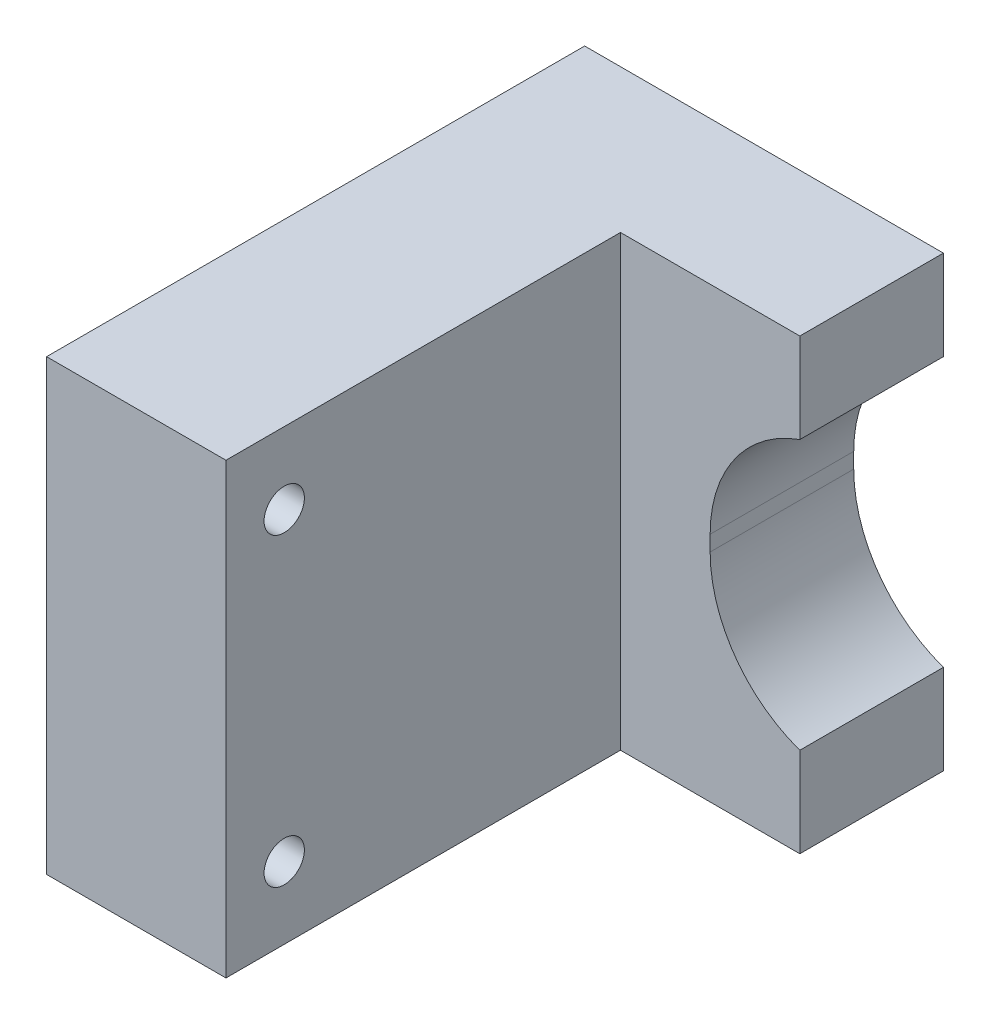
ISO-10303-21;
HEADER;
FILE_DESCRIPTION(('STEP AP214'),'2;1');
FILE_NAME('part.step','',(''),(''),'','','');
FILE_SCHEMA(('AUTOMOTIVE_DESIGN { 1 0 10303 214 1 1 1 1 }'));
ENDSEC;
DATA;
#1=APPLICATION_CONTEXT('core data for automotive mechanical design processes');
#2=APPLICATION_PROTOCOL_DEFINITION('international standard','automotive_design',2000,#1);
#3=PRODUCT_CONTEXT('',#1,'mechanical');
#4=PRODUCT('Part','Part','',(#3));
#5=PRODUCT_RELATED_PRODUCT_CATEGORY('part','',(#4));
#6=PRODUCT_DEFINITION_FORMATION('','',#4);
#7=PRODUCT_DEFINITION_CONTEXT('part definition',#1,'design');
#8=PRODUCT_DEFINITION('design','',#6,#7);
#9=PRODUCT_DEFINITION_SHAPE('','',#8);
#10=(LENGTH_UNIT() NAMED_UNIT(*) SI_UNIT(.MILLI.,.METRE.));
#11=(NAMED_UNIT(*) PLANE_ANGLE_UNIT() SI_UNIT($,.RADIAN.));
#12=(NAMED_UNIT(*) SI_UNIT($,.STERADIAN.) SOLID_ANGLE_UNIT());
#13=UNCERTAINTY_MEASURE_WITH_UNIT(LENGTH_MEASURE(1.E-05),#10,'distance_accuracy_value','');
#14=(GEOMETRIC_REPRESENTATION_CONTEXT(3) GLOBAL_UNCERTAINTY_ASSIGNED_CONTEXT((#13)) GLOBAL_UNIT_ASSIGNED_CONTEXT((#10,
#11,#12)) REPRESENTATION_CONTEXT('',''));
#15=CARTESIAN_POINT('',(0.,0.,0.));
#16=DIRECTION('',(0.,0.,1.));
#17=DIRECTION('',(1.,0.,0.));
#18=AXIS2_PLACEMENT_3D('',#15,#16,#17);
#19=CARTESIAN_POINT('',(-10.,50.,0.));
#20=DIRECTION('',(-1.,0.,0.));
#21=DIRECTION('',(0.,0.,1.));
#22=AXIS2_PLACEMENT_3D('',#19,#20,#21);
#23=PLANE('',#22);
#24=CARTESIAN_POINT('',(-10.,8.,23.5));
#25=DIRECTION('',(-1.,0.,0.));
#26=DIRECTION('',(0.,0.,1.));
#27=AXIS2_PLACEMENT_3D('',#24,#25,#26);
#28=CIRCLE('',#27,4.2164);
#29=CARTESIAN_POINT('',(-10.,8.,27.7164));
#30=VERTEX_POINT('',#29);
#31=EDGE_CURVE('E194',#30,#30,#28,.T.);
#32=ORIENTED_EDGE('',*,*,#31,.F.);
#33=EDGE_LOOP('',(#32));
#34=FACE_BOUND('',#33,.T.);
#35=CARTESIAN_POINT('',(-10.,42.,23.5));
#36=DIRECTION('',(-1.,0.,0.));
#37=DIRECTION('',(0.,0.,1.));
#38=AXIS2_PLACEMENT_3D('',#35,#36,#37);
#39=CIRCLE('',#38,4.2164);
#40=CARTESIAN_POINT('',(-10.,42.,27.7164));
#41=VERTEX_POINT('',#40);
#42=EDGE_CURVE('E208',#41,#41,#39,.T.);
#43=ORIENTED_EDGE('',*,*,#42,.F.);
#44=EDGE_LOOP('',(#43));
#45=FACE_BOUND('',#44,.T.);
#46=DIRECTION('',(0.,0.,-1.));
#47=VECTOR('',#46,1.);
#48=CARTESIAN_POINT('',(-10.,0.,0.));
#49=LINE('',#48,#47);
#50=CARTESIAN_POINT('',(-10.,0.,30.));
#51=VERTEX_POINT('',#50);
#52=CARTESIAN_POINT('',(-10.,0.,-30.));
#53=VERTEX_POINT('',#52);
#54=EDGE_CURVE('E225',#51,#53,#49,.T.);
#55=ORIENTED_EDGE('',*,*,#54,.F.);
#56=DIRECTION('',(0.,-1.,0.));
#57=VECTOR('',#56,1.);
#58=CARTESIAN_POINT('',(-10.,50.,30.));
#59=LINE('',#58,#57);
#60=CARTESIAN_POINT('',(-10.,50.,30.));
#61=VERTEX_POINT('',#60);
#62=EDGE_CURVE('E276',#61,#51,#59,.T.);
#63=ORIENTED_EDGE('',*,*,#62,.F.);
#64=DIRECTION('',(0.,0.,-1.));
#65=VECTOR('',#64,1.);
#66=CARTESIAN_POINT('',(-10.,50.,0.));
#67=LINE('',#66,#65);
#68=CARTESIAN_POINT('',(-10.,50.,-30.));
#69=VERTEX_POINT('',#68);
#70=EDGE_CURVE('E230',#61,#69,#67,.T.);
#71=ORIENTED_EDGE('',*,*,#70,.T.);
#72=DIRECTION('',(0.,-1.,0.));
#73=VECTOR('',#72,1.);
#74=CARTESIAN_POINT('',(-10.,50.,-30.));
#75=LINE('',#74,#73);
#76=EDGE_CURVE('E246',#69,#53,#75,.T.);
#77=ORIENTED_EDGE('',*,*,#76,.T.);
#78=EDGE_LOOP('',(#55,#63,#71,#77));
#79=FACE_BOUND('',#78,.T.);
#80=DIRECTION('',(0.,1.,0.));
#81=VECTOR('',#80,1.);
#82=CARTESIAN_POINT('',(-10.,15.,20.));
#83=LINE('',#82,#81);
#84=CARTESIAN_POINT('',(-10.,15.,20.));
#85=VERTEX_POINT('',#84);
#86=CARTESIAN_POINT('',(-10.,35.,20.));
#87=VERTEX_POINT('',#86);
#88=EDGE_CURVE('E171',#85,#87,#83,.T.);
#89=ORIENTED_EDGE('',*,*,#88,.F.);
#90=DIRECTION('',(0.,0.,-1.));
#91=VECTOR('',#90,1.);
#92=CARTESIAN_POINT('',(-10.,15.,20.));
#93=LINE('',#92,#91);
#94=CARTESIAN_POINT('',(-10.,15.,10.));
#95=VERTEX_POINT('',#94);
#96=EDGE_CURVE('E154',#85,#95,#93,.T.);
#97=ORIENTED_EDGE('',*,*,#96,.T.);
#98=DIRECTION('',(0.,1.,0.));
#99=VECTOR('',#98,1.);
#100=CARTESIAN_POINT('',(-10.,15.,10.));
#101=LINE('',#100,#99);
#102=CARTESIAN_POINT('',(-10.,35.,10.));
#103=VERTEX_POINT('',#102);
#104=EDGE_CURVE('E164',#95,#103,#101,.T.);
#105=ORIENTED_EDGE('',*,*,#104,.T.);
#106=DIRECTION('',(0.,0.,-1.));
#107=VECTOR('',#106,1.);
#108=CARTESIAN_POINT('',(-10.,35.,20.));
#109=LINE('',#108,#107);
#110=EDGE_CURVE('E169',#87,#103,#109,.T.);
#111=ORIENTED_EDGE('',*,*,#110,.F.);
#112=EDGE_LOOP('',(#89,#97,#105,#111));
#113=FACE_BOUND('',#112,.T.);
#114=ADVANCED_FACE('F35',(#34,#45,#79,#113),#23,.T.);
#115=CARTESIAN_POINT('',(-7.,15.,20.));
#116=DIRECTION('',(-1.,0.,0.));
#117=DIRECTION('',(0.,0.,1.));
#118=AXIS2_PLACEMENT_3D('',#115,#116,#117);
#119=PLANE('',#118);
#120=DIRECTION('',(0.,1.,0.));
#121=VECTOR('',#120,1.);
#122=CARTESIAN_POINT('',(-7.,15.,10.));
#123=LINE('',#122,#121);
#124=CARTESIAN_POINT('',(-6.99999999999999,15.,10.));
#125=VERTEX_POINT('',#124);
#126=CARTESIAN_POINT('',(-6.99999999999999,35.,10.));
#127=VERTEX_POINT('',#126);
#128=EDGE_CURVE('E160',#125,#127,#123,.T.);
#129=ORIENTED_EDGE('',*,*,#128,.F.);
#130=DIRECTION('',(0.,0.,-1.));
#131=VECTOR('',#130,1.);
#132=CARTESIAN_POINT('',(-7.,15.,20.));
#133=LINE('',#132,#131);
#134=CARTESIAN_POINT('',(-7.,15.,-30.));
#135=VERTEX_POINT('',#134);
#136=EDGE_CURVE('E157',#125,#135,#133,.T.);
#137=ORIENTED_EDGE('',*,*,#136,.T.);
#138=DIRECTION('',(0.,1.,0.));
#139=VECTOR('',#138,1.);
#140=CARTESIAN_POINT('',(-7.,15.,-30.));
#141=LINE('',#140,#139);
#142=CARTESIAN_POINT('',(-7.,35.,-30.));
#143=VERTEX_POINT('',#142);
#144=EDGE_CURVE('E178',#135,#143,#141,.T.);
#145=ORIENTED_EDGE('',*,*,#144,.T.);
#146=DIRECTION('',(0.,0.,-1.));
#147=VECTOR('',#146,1.);
#148=CARTESIAN_POINT('',(-7.,35.,20.));
#149=LINE('',#148,#147);
#150=EDGE_CURVE('E58',#127,#143,#149,.T.);
#151=ORIENTED_EDGE('',*,*,#150,.F.);
#152=EDGE_LOOP('',(#129,#137,#145,#151));
#153=FACE_BOUND('',#152,.T.);
#154=ADVANCED_FACE('F345',(#153),#119,.F.);
#155=CARTESIAN_POINT('',(30.,50.,0.));
#156=DIRECTION('',(1.,0.,0.));
#157=DIRECTION('',(0.,0.,-1.));
#158=AXIS2_PLACEMENT_3D('',#155,#156,#157);
#159=PLANE('',#158);
#160=DIRECTION('',(0.,0.,1.));
#161=VECTOR('',#160,1.);
#162=CARTESIAN_POINT('',(30.,40.,-13.9903927951499));
#163=LINE('',#162,#161);
#164=CARTESIAN_POINT('',(30.,40.,-30.));
#165=VERTEX_POINT('',#164);
#166=CARTESIAN_POINT('',(30.,40.,-13.9903927951499));
#167=VERTEX_POINT('',#166);
#168=EDGE_CURVE('E222',#165,#167,#163,.T.);
#169=ORIENTED_EDGE('',*,*,#168,.F.);
#170=DIRECTION('',(0.,-1.,0.));
#171=VECTOR('',#170,1.);
#172=CARTESIAN_POINT('',(30.,50.,-30.));
#173=LINE('',#172,#171);
#174=CARTESIAN_POINT('',(30.,50.,-30.));
#175=VERTEX_POINT('',#174);
#176=EDGE_CURVE('E264',#175,#165,#173,.T.);
#177=ORIENTED_EDGE('',*,*,#176,.F.);
#178=DIRECTION('',(0.,0.,1.));
#179=VECTOR('',#178,1.);
#180=CARTESIAN_POINT('',(30.,50.,0.));
#181=LINE('',#180,#179);
#182=CARTESIAN_POINT('',(30.,50.,-13.9903927951499));
#183=VERTEX_POINT('',#182);
#184=EDGE_CURVE('E241',#175,#183,#181,.T.);
#185=ORIENTED_EDGE('',*,*,#184,.T.);
#186=DIRECTION('',(0.,-1.,0.));
#187=VECTOR('',#186,1.);
#188=CARTESIAN_POINT('',(30.,50.,-13.9903927951499));
#189=LINE('',#188,#187);
#190=EDGE_CURVE('E268',#183,#167,#189,.T.);
#191=ORIENTED_EDGE('',*,*,#190,.T.);
#192=EDGE_LOOP('',(#169,#177,#185,#191));
#193=FACE_BOUND('',#192,.T.);
#194=ADVANCED_FACE('F295',(#193),#159,.T.);
#195=CARTESIAN_POINT('',(0.,50.,30.));
#196=DIRECTION('',(0.,0.,1.));
#197=DIRECTION('',(1.,0.,0.));
#198=AXIS2_PLACEMENT_3D('',#195,#196,#197);
#199=PLANE('',#198);
#200=DIRECTION('',(-1.,0.,0.));
#201=VECTOR('',#200,1.);
#202=CARTESIAN_POINT('',(0.,0.,30.));
#203=LINE('',#202,#201);
#204=CARTESIAN_POINT('',(10.,0.,30.));
#205=VERTEX_POINT('',#204);
#206=EDGE_CURVE('E249',#205,#51,#203,.T.);
#207=ORIENTED_EDGE('',*,*,#206,.F.);
#208=DIRECTION('',(0.,-1.,0.));
#209=VECTOR('',#208,1.);
#210=CARTESIAN_POINT('',(10.,50.,30.));
#211=LINE('',#210,#209);
#212=CARTESIAN_POINT('',(10.,50.,30.));
#213=VERTEX_POINT('',#212);
#214=EDGE_CURVE('E274',#213,#205,#211,.T.);
#215=ORIENTED_EDGE('',*,*,#214,.F.);
#216=DIRECTION('',(-1.,0.,0.));
#217=VECTOR('',#216,1.);
#218=CARTESIAN_POINT('',(0.,50.,30.));
#219=LINE('',#218,#217);
#220=EDGE_CURVE('E233',#213,#61,#219,.T.);
#221=ORIENTED_EDGE('',*,*,#220,.T.);
#222=ORIENTED_EDGE('',*,*,#62,.T.);
#223=EDGE_LOOP('',(#207,#215,#221,#222));
#224=FACE_BOUND('',#223,.T.);
#225=ADVANCED_FACE('F327',(#224),#199,.T.);
#226=CARTESIAN_POINT('',(10.,50.,0.));
#227=DIRECTION('',(-1.,0.,0.));
#228=DIRECTION('',(0.,0.,1.));
#229=AXIS2_PLACEMENT_3D('',#226,#227,#228);
#230=PLANE('',#229);
#231=CARTESIAN_POINT('',(10.,8.,23.5));
#232=DIRECTION('',(-1.,0.,0.));
#233=DIRECTION('',(0.,0.,1.));
#234=AXIS2_PLACEMENT_3D('',#231,#232,#233);
#235=CIRCLE('',#234,2.2479);
#236=CARTESIAN_POINT('',(10.,8.,25.7479));
#237=VERTEX_POINT('',#236);
#238=EDGE_CURVE('E205',#237,#237,#235,.T.);
#239=ORIENTED_EDGE('',*,*,#238,.T.);
#240=EDGE_LOOP('',(#239));
#241=FACE_BOUND('',#240,.T.);
#242=CARTESIAN_POINT('',(10.,42.,23.5));
#243=DIRECTION('',(-1.,0.,0.));
#244=DIRECTION('',(0.,0.,1.));
#245=AXIS2_PLACEMENT_3D('',#242,#243,#244);
#246=CIRCLE('',#245,2.2479);
#247=CARTESIAN_POINT('',(10.,42.,25.7479));
#248=VERTEX_POINT('',#247);
#249=EDGE_CURVE('E214',#248,#248,#246,.T.);
#250=ORIENTED_EDGE('',*,*,#249,.T.);
#251=EDGE_LOOP('',(#250));
#252=FACE_BOUND('',#251,.T.);
#253=DIRECTION('',(0.,0.,-1.));
#254=VECTOR('',#253,1.);
#255=CARTESIAN_POINT('',(10.,0.,0.));
#256=LINE('',#255,#254);
#257=CARTESIAN_POINT('',(10.,0.,-13.9903927951499));
#258=VERTEX_POINT('',#257);
#259=EDGE_CURVE('E252',#205,#258,#256,.T.);
#260=ORIENTED_EDGE('',*,*,#259,.T.);
#261=DIRECTION('',(0.,-1.,0.));
#262=VECTOR('',#261,1.);
#263=CARTESIAN_POINT('',(10.,50.,-13.9903927951499));
#264=LINE('',#263,#262);
#265=CARTESIAN_POINT('',(10.,50.,-13.9903927951499));
#266=VERTEX_POINT('',#265);
#267=EDGE_CURVE('E271',#266,#258,#264,.T.);
#268=ORIENTED_EDGE('',*,*,#267,.F.);
#269=DIRECTION('',(0.,0.,-1.));
#270=VECTOR('',#269,1.);
#271=CARTESIAN_POINT('',(10.,50.,0.));
#272=LINE('',#271,#270);
#273=EDGE_CURVE('E237',#213,#266,#272,.T.);
#274=ORIENTED_EDGE('',*,*,#273,.F.);
#275=ORIENTED_EDGE('',*,*,#214,.T.);
#276=EDGE_LOOP('',(#260,#268,#274,#275));
#277=FACE_BOUND('',#276,.T.);
#278=ADVANCED_FACE('F331',(#241,#252,#277),#230,.F.);
#279=CARTESIAN_POINT('',(0.,50.,-13.9903927951499));
#280=DIRECTION('',(0.,0.,-1.));
#281=DIRECTION('',(-1.,0.,0.));
#282=AXIS2_PLACEMENT_3D('',#279,#280,#281);
#283=PLANE('',#282);
#284=DIRECTION('',(0.,-1.,0.));
#285=VECTOR('',#284,1.);
#286=CARTESIAN_POINT('',(20.,40.,-13.9903927951499));
#287=LINE('',#286,#285);
#288=CARTESIAN_POINT('',(20.,25.8578643762691,-13.9903927951499));
#289=VERTEX_POINT('',#288);
#290=CARTESIAN_POINT('',(20.,24.142135623731,-13.9903927951499));
#291=VERTEX_POINT('',#290);
#292=EDGE_CURVE('E218',#289,#291,#287,.T.);
#293=ORIENTED_EDGE('',*,*,#292,.F.);
#294=CARTESIAN_POINT('',(35.,25.8578643762691,-13.9903927951499));
#295=DIRECTION('',(0.,0.,-1.));
#296=DIRECTION('',(-1.,0.,0.));
#297=AXIS2_PLACEMENT_3D('',#294,#295,#296);
#298=CIRCLE('',#297,15.);
#299=EDGE_CURVE('E43',#289,#167,#298,.T.);
#300=ORIENTED_EDGE('',*,*,#299,.T.);
#301=ORIENTED_EDGE('',*,*,#190,.F.);
#302=DIRECTION('',(1.,0.,0.));
#303=VECTOR('',#302,1.);
#304=CARTESIAN_POINT('',(0.,50.,-13.9903927951499));
#305=LINE('',#304,#303);
#306=EDGE_CURVE('E239',#266,#183,#305,.T.);
#307=ORIENTED_EDGE('',*,*,#306,.F.);
#308=ORIENTED_EDGE('',*,*,#267,.T.);
#309=DIRECTION('',(1.,0.,0.));
#310=VECTOR('',#309,1.);
#311=CARTESIAN_POINT('',(0.,0.,-13.9903927951499));
#312=LINE('',#311,#310);
#313=CARTESIAN_POINT('',(30.,0.,-13.9903927951499));
#314=VERTEX_POINT('',#313);
#315=EDGE_CURVE('E254',#258,#314,#312,.T.);
#316=ORIENTED_EDGE('',*,*,#315,.T.);
#317=CARTESIAN_POINT('',(30.,10.,-13.9903927951499));
#318=VERTEX_POINT('',#317);
#319=EDGE_CURVE('E267',#318,#314,#189,.T.);
#320=ORIENTED_EDGE('',*,*,#319,.F.);
#321=CARTESIAN_POINT('',(35.,24.142135623731,-13.9903927951499));
#322=DIRECTION('',(0.,0.,-1.));
#323=DIRECTION('',(-1.,0.,0.));
#324=AXIS2_PLACEMENT_3D('',#321,#322,#323);
#325=CIRCLE('',#324,15.);
#326=EDGE_CURVE('E286',#318,#291,#325,.T.);
#327=ORIENTED_EDGE('',*,*,#326,.T.);
#328=EDGE_LOOP('',(#293,#300,#301,#307,#308,#316,#320,#327));
#329=FACE_BOUND('',#328,.T.);
#330=ADVANCED_FACE('F290',(#329),#283,.F.);
#331=DIRECTION('',(0.,0.,-1.));
#332=VECTOR('',#331,1.);
#333=CARTESIAN_POINT('',(30.,10.,-13.9903927951499));
#334=LINE('',#333,#332);
#335=CARTESIAN_POINT('',(30.,10.,-30.));
#336=VERTEX_POINT('',#335);
#337=EDGE_CURVE('E217',#318,#336,#334,.T.);
#338=ORIENTED_EDGE('',*,*,#337,.F.);
#339=ORIENTED_EDGE('',*,*,#319,.T.);
#340=DIRECTION('',(0.,0.,1.));
#341=VECTOR('',#340,1.);
#342=CARTESIAN_POINT('',(30.,0.,0.));
#343=LINE('',#342,#341);
#344=CARTESIAN_POINT('',(30.,0.,-30.));
#345=VERTEX_POINT('',#344);
#346=EDGE_CURVE('E257',#345,#314,#343,.T.);
#347=ORIENTED_EDGE('',*,*,#346,.F.);
#348=EDGE_CURVE('E263',#336,#345,#173,.T.);
#349=ORIENTED_EDGE('',*,*,#348,.F.);
#350=EDGE_LOOP('',(#338,#339,#347,#349));
#351=FACE_BOUND('',#350,.T.);
#352=ADVANCED_FACE('F312',(#351),#159,.T.);
#353=CARTESIAN_POINT('',(0.,50.,-30.));
#354=DIRECTION('',(0.,0.,1.));
#355=DIRECTION('',(1.,0.,0.));
#356=AXIS2_PLACEMENT_3D('',#353,#354,#355);
#357=PLANE('',#356);
#358=DIRECTION('',(1.,0.,0.));
#359=VECTOR('',#358,1.);
#360=CARTESIAN_POINT('',(-7.,35.,-30.));
#361=LINE('',#360,#359);
#362=CARTESIAN_POINT('',(3.,35.,-30.));
#363=VERTEX_POINT('',#362);
#364=EDGE_CURVE('E187',#143,#363,#361,.T.);
#365=ORIENTED_EDGE('',*,*,#364,.F.);
#366=ORIENTED_EDGE('',*,*,#144,.F.);
#367=DIRECTION('',(-1.,0.,0.));
#368=VECTOR('',#367,1.);
#369=CARTESIAN_POINT('',(-7.,15.,-30.));
#370=LINE('',#369,#368);
#371=CARTESIAN_POINT('',(3.,15.,-30.));
#372=VERTEX_POINT('',#371);
#373=EDGE_CURVE('E183',#372,#135,#370,.T.);
#374=ORIENTED_EDGE('',*,*,#373,.F.);
#375=DIRECTION('',(0.,-1.,0.));
#376=VECTOR('',#375,1.);
#377=CARTESIAN_POINT('',(3.,15.,-30.));
#378=LINE('',#377,#376);
#379=EDGE_CURVE('E189',#363,#372,#378,.T.);
#380=ORIENTED_EDGE('',*,*,#379,.F.);
#381=EDGE_LOOP('',(#365,#366,#374,#380));
#382=FACE_BOUND('',#381,.T.);
#383=ORIENTED_EDGE('',*,*,#176,.T.);
#384=CARTESIAN_POINT('',(35.,25.8578643762691,-30.));
#385=DIRECTION('',(0.,0.,1.));
#386=DIRECTION('',(1.,0.,0.));
#387=AXIS2_PLACEMENT_3D('',#384,#385,#386);
#388=CIRCLE('',#387,15.);
#389=CARTESIAN_POINT('',(20.,25.8578643762691,-30.));
#390=VERTEX_POINT('',#389);
#391=EDGE_CURVE('E11',#165,#390,#388,.T.);
#392=ORIENTED_EDGE('',*,*,#391,.T.);
#393=DIRECTION('',(0.,1.,0.));
#394=VECTOR('',#393,1.);
#395=CARTESIAN_POINT('',(20.,40.,-30.));
#396=LINE('',#395,#394);
#397=CARTESIAN_POINT('',(20.,24.142135623731,-30.));
#398=VERTEX_POINT('',#397);
#399=EDGE_CURVE('E221',#398,#390,#396,.T.);
#400=ORIENTED_EDGE('',*,*,#399,.F.);
#401=CARTESIAN_POINT('',(35.,24.142135623731,-30.));
#402=DIRECTION('',(0.,0.,1.));
#403=DIRECTION('',(1.,0.,0.));
#404=AXIS2_PLACEMENT_3D('',#401,#402,#403);
#405=CIRCLE('',#404,15.);
#406=EDGE_CURVE('E284',#398,#336,#405,.T.);
#407=ORIENTED_EDGE('',*,*,#406,.T.);
#408=ORIENTED_EDGE('',*,*,#348,.T.);
#409=DIRECTION('',(-1.,0.,0.));
#410=VECTOR('',#409,1.);
#411=CARTESIAN_POINT('',(0.,0.,-30.));
#412=LINE('',#411,#410);
#413=EDGE_CURVE('E234',#345,#53,#412,.T.);
#414=ORIENTED_EDGE('',*,*,#413,.T.);
#415=ORIENTED_EDGE('',*,*,#76,.F.);
#416=DIRECTION('',(-1.,0.,0.));
#417=VECTOR('',#416,1.);
#418=CARTESIAN_POINT('',(0.,50.,-30.));
#419=LINE('',#418,#417);
#420=EDGE_CURVE('E244',#175,#69,#419,.T.);
#421=ORIENTED_EDGE('',*,*,#420,.F.);
#422=EDGE_LOOP('',(#383,#392,#400,#407,#408,#414,#415,#421));
#423=FACE_BOUND('',#422,.T.);
#424=ADVANCED_FACE('F300',(#382,#423),#357,.F.);
#425=CARTESIAN_POINT('',(0.,50.,0.));
#426=DIRECTION('',(0.,1.,0.));
#427=DIRECTION('',(0.,0.,1.));
#428=AXIS2_PLACEMENT_3D('',#425,#426,#427);
#429=PLANE('',#428);
#430=ORIENTED_EDGE('',*,*,#70,.F.);
#431=ORIENTED_EDGE('',*,*,#220,.F.);
#432=ORIENTED_EDGE('',*,*,#273,.T.);
#433=ORIENTED_EDGE('',*,*,#306,.T.);
#434=ORIENTED_EDGE('',*,*,#184,.F.);
#435=ORIENTED_EDGE('',*,*,#420,.T.);
#436=EDGE_LOOP('',(#430,#431,#432,#433,#434,#435));
#437=FACE_BOUND('',#436,.T.);
#438=ADVANCED_FACE('F324',(#437),#429,.T.);
#439=CARTESIAN_POINT('',(0.,0.,0.));
#440=DIRECTION('',(0.,1.,0.));
#441=DIRECTION('',(0.,0.,1.));
#442=AXIS2_PLACEMENT_3D('',#439,#440,#441);
#443=PLANE('',#442);
#444=ORIENTED_EDGE('',*,*,#54,.T.);
#445=ORIENTED_EDGE('',*,*,#413,.F.);
#446=ORIENTED_EDGE('',*,*,#346,.T.);
#447=ORIENTED_EDGE('',*,*,#315,.F.);
#448=ORIENTED_EDGE('',*,*,#259,.F.);
#449=ORIENTED_EDGE('',*,*,#206,.T.);
#450=EDGE_LOOP('',(#444,#445,#446,#447,#448,#449));
#451=FACE_BOUND('',#450,.T.);
#452=ADVANCED_FACE('F316',(#451),#443,.F.);
#453=CARTESIAN_POINT('',(20.,0.,0.));
#454=DIRECTION('',(1.,0.,0.));
#455=DIRECTION('',(0.,0.,-1.));
#456=AXIS2_PLACEMENT_3D('',#453,#454,#455);
#457=PLANE('',#456);
#458=ORIENTED_EDGE('',*,*,#292,.T.);
#459=DIRECTION('',(0.,0.,-1.));
#460=VECTOR('',#459,1.);
#461=CARTESIAN_POINT('',(20.,24.142135623731,-30.));
#462=LINE('',#461,#460);
#463=EDGE_CURVE('E281',#291,#398,#462,.T.);
#464=ORIENTED_EDGE('',*,*,#463,.T.);
#465=ORIENTED_EDGE('',*,*,#399,.T.);
#466=DIRECTION('',(0.,0.,1.));
#467=VECTOR('',#466,1.);
#468=CARTESIAN_POINT('',(20.,25.8578643762691,-13.9903927951499));
#469=LINE('',#468,#467);
#470=EDGE_CURVE('E278',#390,#289,#469,.T.);
#471=ORIENTED_EDGE('',*,*,#470,.T.);
#472=EDGE_LOOP('',(#458,#464,#465,#471));
#473=FACE_BOUND('',#472,.T.);
#474=ADVANCED_FACE('F303',(#473),#457,.T.);
#475=CARTESIAN_POINT('',(35.,24.142135623731,-13.9903927951499));
#476=DIRECTION('',(0.,0.,1.));
#477=DIRECTION('',(1.,0.,0.));
#478=AXIS2_PLACEMENT_3D('',#475,#476,#477);
#479=CYLINDRICAL_SURFACE('',#478,15.);
#480=ORIENTED_EDGE('',*,*,#326,.F.);
#481=ORIENTED_EDGE('',*,*,#337,.T.);
#482=ORIENTED_EDGE('',*,*,#406,.F.);
#483=ORIENTED_EDGE('',*,*,#463,.F.);
#484=EDGE_LOOP('',(#480,#481,#482,#483));
#485=FACE_BOUND('',#484,.T.);
#486=ADVANCED_FACE('F307',(#485),#479,.F.);
#487=CARTESIAN_POINT('',(35.,25.8578643762691,-13.9903927951499));
#488=DIRECTION('',(0.,0.,-1.));
#489=DIRECTION('',(-1.,0.,0.));
#490=AXIS2_PLACEMENT_3D('',#487,#488,#489);
#491=CYLINDRICAL_SURFACE('',#490,15.);
#492=ORIENTED_EDGE('',*,*,#391,.F.);
#493=ORIENTED_EDGE('',*,*,#168,.T.);
#494=ORIENTED_EDGE('',*,*,#299,.F.);
#495=ORIENTED_EDGE('',*,*,#470,.F.);
#496=EDGE_LOOP('',(#492,#493,#494,#495));
#497=FACE_BOUND('',#496,.T.);
#498=ADVANCED_FACE('F37',(#497),#491,.F.);
#499=CARTESIAN_POINT('',(-10.,42.,23.5));
#500=DIRECTION('',(-1.,0.,0.));
#501=DIRECTION('',(0.,0.,1.));
#502=AXIS2_PLACEMENT_3D('',#499,#500,#501);
#503=CYLINDRICAL_SURFACE('',#502,2.2479);
#504=ORIENTED_EDGE('',*,*,#249,.F.);
#505=EDGE_LOOP('',(#504));
#506=FACE_BOUND('',#505,.T.);
#507=CARTESIAN_POINT('',(-8.34823237602752,42.,23.5));
#508=DIRECTION('',(-1.,0.,0.));
#509=DIRECTION('',(0.,0.,1.));
#510=AXIS2_PLACEMENT_3D('',#507,#508,#509);
#511=CIRCLE('',#510,2.2479);
#512=CARTESIAN_POINT('',(-8.34823237602752,42.,25.7479));
#513=VERTEX_POINT('',#512);
#514=EDGE_CURVE('E211',#513,#513,#511,.T.);
#515=ORIENTED_EDGE('',*,*,#514,.T.);
#516=EDGE_LOOP('',(#515));
#517=FACE_BOUND('',#516,.T.);
#518=ADVANCED_FACE('F362',(#506,#517),#503,.F.);
#519=CARTESIAN_POINT('',(-10.,42.,23.5));
#520=DIRECTION('',(-1.,0.,0.));
#521=DIRECTION('',(0.,0.,1.));
#522=AXIS2_PLACEMENT_3D('',#519,#520,#521);
#523=CONICAL_SURFACE('',#522,4.2164,0.872664625997166);
#524=ORIENTED_EDGE('',*,*,#514,.F.);
#525=EDGE_LOOP('',(#524));
#526=FACE_BOUND('',#525,.T.);
#527=ORIENTED_EDGE('',*,*,#42,.T.);
#528=EDGE_LOOP('',(#527));
#529=FACE_BOUND('',#528,.T.);
#530=ADVANCED_FACE('F424',(#526,#529),#523,.F.);
#531=CARTESIAN_POINT('',(-10.,8.,23.5));
#532=DIRECTION('',(-1.,0.,0.));
#533=DIRECTION('',(0.,0.,1.));
#534=AXIS2_PLACEMENT_3D('',#531,#532,#533);
#535=CYLINDRICAL_SURFACE('',#534,2.2479);
#536=ORIENTED_EDGE('',*,*,#238,.F.);
#537=EDGE_LOOP('',(#536));
#538=FACE_BOUND('',#537,.T.);
#539=CARTESIAN_POINT('',(-8.34823237602752,8.,23.5));
#540=DIRECTION('',(-1.,0.,0.));
#541=DIRECTION('',(0.,0.,1.));
#542=AXIS2_PLACEMENT_3D('',#539,#540,#541);
#543=CIRCLE('',#542,2.2479);
#544=CARTESIAN_POINT('',(-8.34823237602752,8.,25.7479));
#545=VERTEX_POINT('',#544);
#546=EDGE_CURVE('E202',#545,#545,#543,.T.);
#547=ORIENTED_EDGE('',*,*,#546,.T.);
#548=EDGE_LOOP('',(#547));
#549=FACE_BOUND('',#548,.T.);
#550=ADVANCED_FACE('F430',(#538,#549),#535,.F.);
#551=CARTESIAN_POINT('',(-10.,8.,23.5));
#552=DIRECTION('',(-1.,0.,0.));
#553=DIRECTION('',(0.,0.,1.));
#554=AXIS2_PLACEMENT_3D('',#551,#552,#553);
#555=CONICAL_SURFACE('',#554,4.2164,0.872664625997165);
#556=ORIENTED_EDGE('',*,*,#546,.F.);
#557=EDGE_LOOP('',(#556));
#558=FACE_BOUND('',#557,.T.);
#559=ORIENTED_EDGE('',*,*,#31,.T.);
#560=EDGE_LOOP('',(#559));
#561=FACE_BOUND('',#560,.T.);
#562=ADVANCED_FACE('F437',(#558,#561),#555,.F.);
#563=CARTESIAN_POINT('',(-7.,15.,20.));
#564=DIRECTION('',(0.,-1.,0.));
#565=DIRECTION('',(0.,0.,-1.));
#566=AXIS2_PLACEMENT_3D('',#563,#564,#565);
#567=PLANE('',#566);
#568=DIRECTION('',(0.,0.,-1.));
#569=VECTOR('',#568,1.);
#570=CARTESIAN_POINT('',(3.,15.,20.));
#571=LINE('',#570,#569);
#572=CARTESIAN_POINT('',(3.,15.,20.));
#573=VERTEX_POINT('',#572);
#574=EDGE_CURVE('E195',#573,#372,#571,.T.);
#575=ORIENTED_EDGE('',*,*,#574,.T.);
#576=ORIENTED_EDGE('',*,*,#373,.T.);
#577=ORIENTED_EDGE('',*,*,#136,.F.);
#578=DIRECTION('',(-1.,0.,0.));
#579=VECTOR('',#578,1.);
#580=CARTESIAN_POINT('',(3.,15.,10.));
#581=LINE('',#580,#579);
#582=EDGE_CURVE('E150',#125,#95,#581,.T.);
#583=ORIENTED_EDGE('',*,*,#582,.T.);
#584=ORIENTED_EDGE('',*,*,#96,.F.);
#585=DIRECTION('',(-1.,0.,0.));
#586=VECTOR('',#585,1.);
#587=CARTESIAN_POINT('',(-7.,15.,20.));
#588=LINE('',#587,#586);
#589=EDGE_CURVE('E50',#573,#85,#588,.T.);
#590=ORIENTED_EDGE('',*,*,#589,.F.);
#591=EDGE_LOOP('',(#575,#576,#577,#583,#584,#590));
#592=FACE_BOUND('',#591,.T.);
#593=ADVANCED_FACE('F152',(#592),#567,.F.);
#594=CARTESIAN_POINT('',(3.,15.,20.));
#595=DIRECTION('',(1.,0.,0.));
#596=DIRECTION('',(0.,0.,-1.));
#597=AXIS2_PLACEMENT_3D('',#594,#595,#596);
#598=PLANE('',#597);
#599=DIRECTION('',(0.,0.,-1.));
#600=VECTOR('',#599,1.);
#601=CARTESIAN_POINT('',(3.,35.,20.));
#602=LINE('',#601,#600);
#603=CARTESIAN_POINT('',(3.,35.,20.));
#604=VERTEX_POINT('',#603);
#605=EDGE_CURVE('E197',#604,#363,#602,.T.);
#606=ORIENTED_EDGE('',*,*,#605,.T.);
#607=ORIENTED_EDGE('',*,*,#379,.T.);
#608=ORIENTED_EDGE('',*,*,#574,.F.);
#609=DIRECTION('',(0.,-1.,0.));
#610=VECTOR('',#609,1.);
#611=CARTESIAN_POINT('',(3.,15.,20.));
#612=LINE('',#611,#610);
#613=EDGE_CURVE('E182',#604,#573,#612,.T.);
#614=ORIENTED_EDGE('',*,*,#613,.F.);
#615=EDGE_LOOP('',(#606,#607,#608,#614));
#616=FACE_BOUND('',#615,.T.);
#617=ADVANCED_FACE('F460',(#616),#598,.F.);
#618=CARTESIAN_POINT('',(-7.,35.,20.));
#619=DIRECTION('',(0.,1.,0.));
#620=DIRECTION('',(0.,0.,1.));
#621=AXIS2_PLACEMENT_3D('',#618,#619,#620);
#622=PLANE('',#621);
#623=DIRECTION('',(1.,0.,0.));
#624=VECTOR('',#623,1.);
#625=CARTESIAN_POINT('',(-7.,35.,20.));
#626=LINE('',#625,#624);
#627=EDGE_CURVE('E179',#87,#604,#626,.T.);
#628=ORIENTED_EDGE('',*,*,#627,.F.);
#629=ORIENTED_EDGE('',*,*,#110,.T.);
#630=DIRECTION('',(-1.,0.,0.));
#631=VECTOR('',#630,1.);
#632=CARTESIAN_POINT('',(3.,35.,10.));
#633=LINE('',#632,#631);
#634=EDGE_CURVE('E161',#127,#103,#633,.T.);
#635=ORIENTED_EDGE('',*,*,#634,.F.);
#636=ORIENTED_EDGE('',*,*,#150,.T.);
#637=ORIENTED_EDGE('',*,*,#364,.T.);
#638=ORIENTED_EDGE('',*,*,#605,.F.);
#639=EDGE_LOOP('',(#628,#629,#635,#636,#637,#638));
#640=FACE_BOUND('',#639,.T.);
#641=ADVANCED_FACE('F466',(#640),#622,.F.);
#642=CARTESIAN_POINT('',(0.,0.,20.));
#643=DIRECTION('',(0.,0.,-1.));
#644=DIRECTION('',(-1.,0.,0.));
#645=AXIS2_PLACEMENT_3D('',#642,#643,#644);
#646=PLANE('',#645);
#647=ORIENTED_EDGE('',*,*,#589,.T.);
#648=ORIENTED_EDGE('',*,*,#88,.T.);
#649=ORIENTED_EDGE('',*,*,#627,.T.);
#650=ORIENTED_EDGE('',*,*,#613,.T.);
#651=EDGE_LOOP('',(#647,#648,#649,#650));
#652=FACE_BOUND('',#651,.T.);
#653=ADVANCED_FACE('F474',(#652),#646,.T.);
#654=CARTESIAN_POINT('',(3.,15.,10.));
#655=DIRECTION('',(0.,0.,1.));
#656=DIRECTION('',(0.,-1.,0.));
#657=AXIS2_PLACEMENT_3D('',#654,#655,#656);
#658=PLANE('',#657);
#659=ORIENTED_EDGE('',*,*,#128,.T.);
#660=ORIENTED_EDGE('',*,*,#634,.T.);
#661=ORIENTED_EDGE('',*,*,#104,.F.);
#662=ORIENTED_EDGE('',*,*,#582,.F.);
#663=EDGE_LOOP('',(#659,#660,#661,#662));
#664=FACE_BOUND('',#663,.T.);
#665=ADVANCED_FACE('F165',(#664),#658,.T.);
#666=CLOSED_SHELL('',(#114,#154,#194,#225,#278,#330,#352,#424,#438,#452,#474,#486,#498,#518,
#530,#550,#562,#593,#617,#641,#653,#665));
#667=MANIFOLD_SOLID_BREP('B2',#666);
#668=ADVANCED_BREP_SHAPE_REPRESENTATION('',(#18,#667),#14);
#669=SHAPE_DEFINITION_REPRESENTATION(#9,#668);
ENDSEC;
END-ISO-10303-21;
